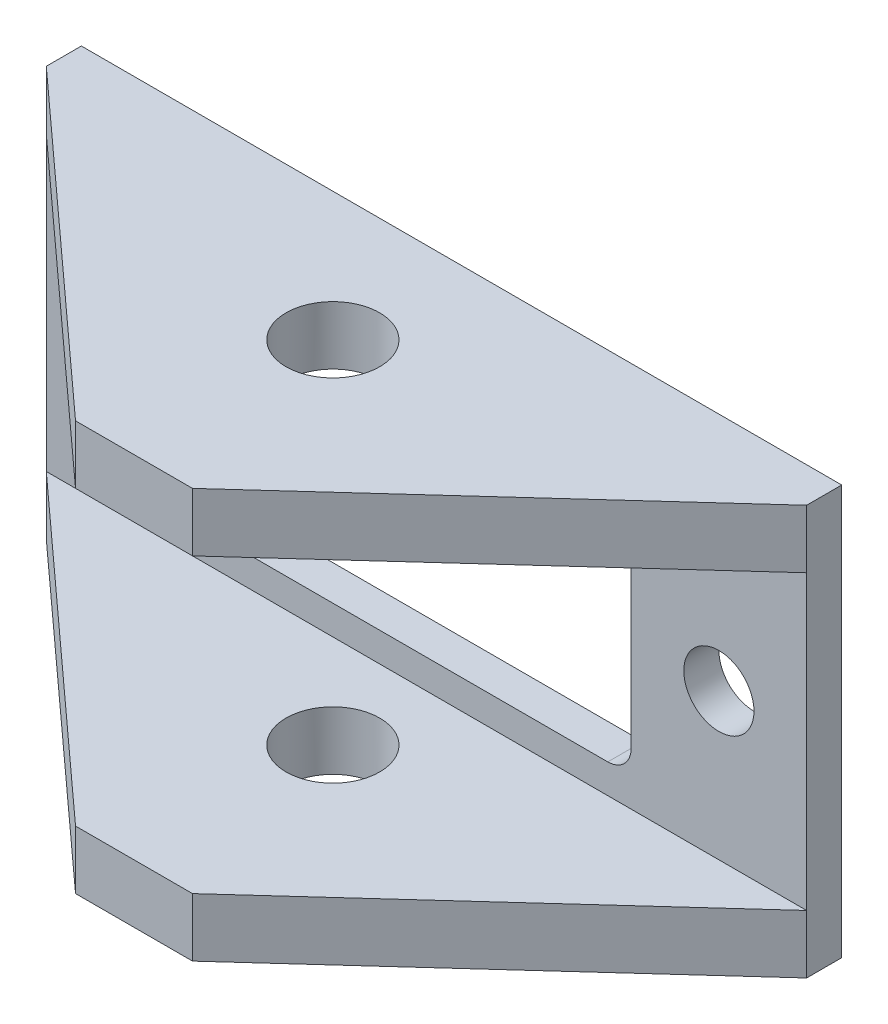
ISO-10303-21;
HEADER;
FILE_DESCRIPTION(('STEP AP214'),'2;1');
FILE_NAME('part.step','',(''),(''),'','','');
FILE_SCHEMA(('AUTOMOTIVE_DESIGN { 1 0 10303 214 1 1 1 1 }'));
ENDSEC;
DATA;
#1=APPLICATION_CONTEXT('core data for automotive mechanical design processes');
#2=APPLICATION_PROTOCOL_DEFINITION('international standard','automotive_design',2000,#1);
#3=PRODUCT_CONTEXT('',#1,'mechanical');
#4=PRODUCT('Part','Part','',(#3));
#5=PRODUCT_RELATED_PRODUCT_CATEGORY('part','',(#4));
#6=PRODUCT_DEFINITION_FORMATION('','',#4);
#7=PRODUCT_DEFINITION_CONTEXT('part definition',#1,'design');
#8=PRODUCT_DEFINITION('design','',#6,#7);
#9=PRODUCT_DEFINITION_SHAPE('','',#8);
#10=(LENGTH_UNIT() NAMED_UNIT(*) SI_UNIT(.MILLI.,.METRE.));
#11=(NAMED_UNIT(*) PLANE_ANGLE_UNIT() SI_UNIT($,.RADIAN.));
#12=(NAMED_UNIT(*) SI_UNIT($,.STERADIAN.) SOLID_ANGLE_UNIT());
#13=UNCERTAINTY_MEASURE_WITH_UNIT(LENGTH_MEASURE(1.E-05),#10,'distance_accuracy_value','');
#14=(GEOMETRIC_REPRESENTATION_CONTEXT(3) GLOBAL_UNCERTAINTY_ASSIGNED_CONTEXT((#13)) GLOBAL_UNIT_ASSIGNED_CONTEXT((#10,
#11,#12)) REPRESENTATION_CONTEXT('',''));
#15=CARTESIAN_POINT('',(0.,0.,0.));
#16=DIRECTION('',(0.,0.,1.));
#17=DIRECTION('',(1.,0.,0.));
#18=AXIS2_PLACEMENT_3D('',#15,#16,#17);
#19=CARTESIAN_POINT('',(0.,35.,-12.5));
#20=DIRECTION('',(0.,0.,-1.));
#21=DIRECTION('',(-1.,0.,0.));
#22=AXIS2_PLACEMENT_3D('',#19,#20,#21);
#23=PLANE('',#22);
#24=CARTESIAN_POINT('',(-25.,17.5,-12.5));
#25=DIRECTION('',(0.,0.,1.));
#26=DIRECTION('',(1.,0.,0.));
#27=AXIS2_PLACEMENT_3D('',#24,#25,#26);
#28=CIRCLE('',#27,3.);
#29=CARTESIAN_POINT('',(-22.,17.5,-12.5));
#30=VERTEX_POINT('',#29);
#31=EDGE_CURVE('E288',#30,#30,#28,.T.);
#32=ORIENTED_EDGE('',*,*,#31,.T.);
#33=EDGE_LOOP('',(#32));
#34=FACE_BOUND('',#33,.T.);
#35=CARTESIAN_POINT('',(25.,17.5,-12.5));
#36=DIRECTION('',(0.,0.,1.));
#37=DIRECTION('',(1.,0.,0.));
#38=AXIS2_PLACEMENT_3D('',#35,#36,#37);
#39=CIRCLE('',#38,3.);
#40=CARTESIAN_POINT('',(28.,17.5,-12.5));
#41=VERTEX_POINT('',#40);
#42=EDGE_CURVE('E282',#41,#41,#39,.T.);
#43=ORIENTED_EDGE('',*,*,#42,.T.);
#44=EDGE_LOOP('',(#43));
#45=FACE_BOUND('',#44,.T.);
#46=DIRECTION('',(1.,0.,0.));
#47=VECTOR('',#46,1.);
#48=CARTESIAN_POINT('',(0.,0.,-12.5));
#49=LINE('',#48,#47);
#50=CARTESIAN_POINT('',(-32.5,0.,-12.5));
#51=VERTEX_POINT('',#50);
#52=CARTESIAN_POINT('',(32.5,0.,-12.5));
#53=VERTEX_POINT('',#52);
#54=EDGE_CURVE('E330',#51,#53,#49,.T.);
#55=ORIENTED_EDGE('',*,*,#54,.F.);
#56=DIRECTION('',(0.,-1.,0.));
#57=VECTOR('',#56,1.);
#58=CARTESIAN_POINT('',(-32.5,35.,-12.5));
#59=LINE('',#58,#57);
#60=CARTESIAN_POINT('',(-32.5,35.,-12.5));
#61=VERTEX_POINT('',#60);
#62=EDGE_CURVE('E337',#61,#51,#59,.T.);
#63=ORIENTED_EDGE('',*,*,#62,.F.);
#64=DIRECTION('',(1.,0.,0.));
#65=VECTOR('',#64,1.);
#66=CARTESIAN_POINT('',(0.,35.,-12.5));
#67=LINE('',#66,#65);
#68=CARTESIAN_POINT('',(32.5,35.,-12.5));
#69=VERTEX_POINT('',#68);
#70=EDGE_CURVE('E313',#61,#69,#67,.T.);
#71=ORIENTED_EDGE('',*,*,#70,.T.);
#72=DIRECTION('',(0.,-1.,0.));
#73=VECTOR('',#72,1.);
#74=CARTESIAN_POINT('',(32.5,35.,-12.5));
#75=LINE('',#74,#73);
#76=EDGE_CURVE('E208',#69,#53,#75,.T.);
#77=ORIENTED_EDGE('',*,*,#76,.T.);
#78=EDGE_LOOP('',(#55,#63,#71,#77));
#79=FACE_BOUND('',#78,.T.);
#80=DIRECTION('',(0.,-1.,0.));
#81=VECTOR('',#80,1.);
#82=CARTESIAN_POINT('',(-17.5,0.,-12.5));
#83=LINE('',#82,#81);
#84=CARTESIAN_POINT('',(-17.5,25.5,-12.5));
#85=VERTEX_POINT('',#84);
#86=CARTESIAN_POINT('',(-17.5,9.5,-12.5));
#87=VERTEX_POINT('',#86);
#88=EDGE_CURVE('E285',#85,#87,#83,.T.);
#89=ORIENTED_EDGE('',*,*,#88,.T.);
#90=CARTESIAN_POINT('',(-15.5,9.5,-12.5));
#91=DIRECTION('',(0.,0.,-1.));
#92=DIRECTION('',(-1.,0.,0.));
#93=AXIS2_PLACEMENT_3D('',#90,#91,#92);
#94=CIRCLE('',#93,2.);
#95=CARTESIAN_POINT('',(-15.5,7.5,-12.5));
#96=VERTEX_POINT('',#95);
#97=EDGE_CURVE('E61',#87,#96,#94,.F.);
#98=ORIENTED_EDGE('',*,*,#97,.T.);
#99=DIRECTION('',(1.,0.,0.));
#100=VECTOR('',#99,1.);
#101=CARTESIAN_POINT('',(0.,7.5,-12.5));
#102=LINE('',#101,#100);
#103=CARTESIAN_POINT('',(15.5,7.5,-12.5));
#104=VERTEX_POINT('',#103);
#105=EDGE_CURVE('E233',#96,#104,#102,.T.);
#106=ORIENTED_EDGE('',*,*,#105,.T.);
#107=CARTESIAN_POINT('',(15.5,9.5,-12.5));
#108=DIRECTION('',(0.,0.,-1.));
#109=DIRECTION('',(-1.,0.,0.));
#110=AXIS2_PLACEMENT_3D('',#107,#108,#109);
#111=CIRCLE('',#110,2.);
#112=CARTESIAN_POINT('',(17.5,9.5,-12.5));
#113=VERTEX_POINT('',#112);
#114=EDGE_CURVE('E11',#104,#113,#111,.F.);
#115=ORIENTED_EDGE('',*,*,#114,.T.);
#116=DIRECTION('',(0.,-1.,0.));
#117=VECTOR('',#116,1.);
#118=CARTESIAN_POINT('',(17.5,0.,-12.5));
#119=LINE('',#118,#117);
#120=CARTESIAN_POINT('',(17.5,25.5,-12.5));
#121=VERTEX_POINT('',#120);
#122=EDGE_CURVE('E276',#121,#113,#119,.T.);
#123=ORIENTED_EDGE('',*,*,#122,.F.);
#124=CARTESIAN_POINT('',(15.5,25.5,-12.5));
#125=DIRECTION('',(0.,0.,-1.));
#126=DIRECTION('',(-1.,0.,0.));
#127=AXIS2_PLACEMENT_3D('',#124,#125,#126);
#128=CIRCLE('',#127,2.);
#129=CARTESIAN_POINT('',(15.5,27.5,-12.5));
#130=VERTEX_POINT('',#129);
#131=EDGE_CURVE('E257',#121,#130,#128,.F.);
#132=ORIENTED_EDGE('',*,*,#131,.T.);
#133=DIRECTION('',(1.,0.,0.));
#134=VECTOR('',#133,1.);
#135=CARTESIAN_POINT('',(0.,27.5,-12.5));
#136=LINE('',#135,#134);
#137=CARTESIAN_POINT('',(-15.5,27.5,-12.5));
#138=VERTEX_POINT('',#137);
#139=EDGE_CURVE('E281',#138,#130,#136,.T.);
#140=ORIENTED_EDGE('',*,*,#139,.F.);
#141=CARTESIAN_POINT('',(-15.5,25.5,-12.5));
#142=DIRECTION('',(0.,0.,-1.));
#143=DIRECTION('',(-1.,0.,0.));
#144=AXIS2_PLACEMENT_3D('',#141,#142,#143);
#145=CIRCLE('',#144,2.);
#146=EDGE_CURVE('E261',#138,#85,#145,.F.);
#147=ORIENTED_EDGE('',*,*,#146,.T.);
#148=EDGE_LOOP('',(#89,#98,#106,#115,#123,#132,#140,#147));
#149=FACE_BOUND('',#148,.T.);
#150=ADVANCED_FACE('F38',(#34,#45,#79,#149),#23,.T.);
#151=CARTESIAN_POINT('',(0.,0.,-9.5));
#152=DIRECTION('',(0.,0.,1.));
#153=DIRECTION('',(1.,0.,0.));
#154=AXIS2_PLACEMENT_3D('',#151,#152,#153);
#155=PLANE('',#154);
#156=CARTESIAN_POINT('',(-25.,17.5,-9.5));
#157=DIRECTION('',(0.,0.,1.));
#158=DIRECTION('',(1.,0.,0.));
#159=AXIS2_PLACEMENT_3D('',#156,#157,#158);
#160=CIRCLE('',#159,3.);
#161=CARTESIAN_POINT('',(-22.,17.5,-9.5));
#162=VERTEX_POINT('',#161);
#163=EDGE_CURVE('E232',#162,#162,#160,.T.);
#164=ORIENTED_EDGE('',*,*,#163,.F.);
#165=EDGE_LOOP('',(#164));
#166=FACE_BOUND('',#165,.T.);
#167=CARTESIAN_POINT('',(25.,17.5,-9.5));
#168=DIRECTION('',(0.,0.,1.));
#169=DIRECTION('',(1.,0.,0.));
#170=AXIS2_PLACEMENT_3D('',#167,#168,#169);
#171=CIRCLE('',#170,3.);
#172=CARTESIAN_POINT('',(28.,17.5,-9.5));
#173=VERTEX_POINT('',#172);
#174=EDGE_CURVE('E229',#173,#173,#171,.T.);
#175=ORIENTED_EDGE('',*,*,#174,.F.);
#176=EDGE_LOOP('',(#175));
#177=FACE_BOUND('',#176,.T.);
#178=DIRECTION('',(0.,-1.,0.));
#179=VECTOR('',#178,1.);
#180=CARTESIAN_POINT('',(32.5,0.,-9.5));
#181=LINE('',#180,#179);
#182=CARTESIAN_POINT('',(32.5,30.,-9.5));
#183=VERTEX_POINT('',#182);
#184=CARTESIAN_POINT('',(32.5,5.,-9.5));
#185=VERTEX_POINT('',#184);
#186=EDGE_CURVE('E175',#183,#185,#181,.T.);
#187=ORIENTED_EDGE('',*,*,#186,.F.);
#188=DIRECTION('',(1.,0.,0.));
#189=VECTOR('',#188,1.);
#190=CARTESIAN_POINT('',(0.,30.,-9.5));
#191=LINE('',#190,#189);
#192=CARTESIAN_POINT('',(-32.5,30.,-9.5));
#193=VERTEX_POINT('',#192);
#194=EDGE_CURVE('E164',#193,#183,#191,.T.);
#195=ORIENTED_EDGE('',*,*,#194,.F.);
#196=DIRECTION('',(0.,-1.,0.));
#197=VECTOR('',#196,1.);
#198=CARTESIAN_POINT('',(-32.5,0.,-9.5));
#199=LINE('',#198,#197);
#200=CARTESIAN_POINT('',(-32.5,5.,-9.5));
#201=VERTEX_POINT('',#200);
#202=EDGE_CURVE('E174',#193,#201,#199,.T.);
#203=ORIENTED_EDGE('',*,*,#202,.T.);
#204=DIRECTION('',(1.,0.,0.));
#205=VECTOR('',#204,1.);
#206=CARTESIAN_POINT('',(0.,5.,-9.5));
#207=LINE('',#206,#205);
#208=EDGE_CURVE('E182',#201,#185,#207,.T.);
#209=ORIENTED_EDGE('',*,*,#208,.T.);
#210=EDGE_LOOP('',(#187,#195,#203,#209));
#211=FACE_BOUND('',#210,.T.);
#212=DIRECTION('',(0.,-1.,0.));
#213=VECTOR('',#212,1.);
#214=CARTESIAN_POINT('',(-17.5,0.,-9.5));
#215=LINE('',#214,#213);
#216=CARTESIAN_POINT('',(-17.5,25.5,-9.5));
#217=VERTEX_POINT('',#216);
#218=CARTESIAN_POINT('',(-17.5,9.5,-9.5));
#219=VERTEX_POINT('',#218);
#220=EDGE_CURVE('E220',#217,#219,#215,.T.);
#221=ORIENTED_EDGE('',*,*,#220,.F.);
#222=CARTESIAN_POINT('',(-15.5,25.5,-9.5));
#223=DIRECTION('',(0.,0.,1.));
#224=DIRECTION('',(1.,0.,0.));
#225=AXIS2_PLACEMENT_3D('',#222,#223,#224);
#226=CIRCLE('',#225,2.);
#227=CARTESIAN_POINT('',(-15.5,27.5,-9.5));
#228=VERTEX_POINT('',#227);
#229=EDGE_CURVE('E259',#217,#228,#226,.F.);
#230=ORIENTED_EDGE('',*,*,#229,.T.);
#231=DIRECTION('',(1.,0.,0.));
#232=VECTOR('',#231,1.);
#233=CARTESIAN_POINT('',(0.,27.5,-9.5));
#234=LINE('',#233,#232);
#235=CARTESIAN_POINT('',(15.5,27.5,-9.5));
#236=VERTEX_POINT('',#235);
#237=EDGE_CURVE('E217',#228,#236,#234,.T.);
#238=ORIENTED_EDGE('',*,*,#237,.T.);
#239=CARTESIAN_POINT('',(15.5,25.5,-9.5));
#240=DIRECTION('',(0.,0.,1.));
#241=DIRECTION('',(1.,0.,0.));
#242=AXIS2_PLACEMENT_3D('',#239,#240,#241);
#243=CIRCLE('',#242,2.);
#244=CARTESIAN_POINT('',(17.5,25.5,-9.5));
#245=VERTEX_POINT('',#244);
#246=EDGE_CURVE('E255',#236,#245,#243,.F.);
#247=ORIENTED_EDGE('',*,*,#246,.T.);
#248=DIRECTION('',(0.,-1.,0.));
#249=VECTOR('',#248,1.);
#250=CARTESIAN_POINT('',(17.5,0.,-9.5));
#251=LINE('',#250,#249);
#252=CARTESIAN_POINT('',(17.5,9.5,-9.5));
#253=VERTEX_POINT('',#252);
#254=EDGE_CURVE('E225',#245,#253,#251,.T.);
#255=ORIENTED_EDGE('',*,*,#254,.T.);
#256=CARTESIAN_POINT('',(15.5,9.5,-9.5));
#257=DIRECTION('',(0.,0.,1.));
#258=DIRECTION('',(1.,0.,0.));
#259=AXIS2_PLACEMENT_3D('',#256,#257,#258);
#260=CIRCLE('',#259,2.);
#261=CARTESIAN_POINT('',(15.5,7.5,-9.5));
#262=VERTEX_POINT('',#261);
#263=EDGE_CURVE('E47',#253,#262,#260,.F.);
#264=ORIENTED_EDGE('',*,*,#263,.T.);
#265=DIRECTION('',(1.,0.,0.));
#266=VECTOR('',#265,1.);
#267=CARTESIAN_POINT('',(0.,7.5,-9.5));
#268=LINE('',#267,#266);
#269=CARTESIAN_POINT('',(-15.5,7.5,-9.5));
#270=VERTEX_POINT('',#269);
#271=EDGE_CURVE('E223',#270,#262,#268,.T.);
#272=ORIENTED_EDGE('',*,*,#271,.F.);
#273=CARTESIAN_POINT('',(-15.5,9.5,-9.5));
#274=DIRECTION('',(0.,0.,1.));
#275=DIRECTION('',(1.,0.,0.));
#276=AXIS2_PLACEMENT_3D('',#273,#274,#275);
#277=CIRCLE('',#276,2.);
#278=EDGE_CURVE('E263',#270,#219,#277,.F.);
#279=ORIENTED_EDGE('',*,*,#278,.T.);
#280=EDGE_LOOP('',(#221,#230,#238,#247,#255,#264,#272,#279));
#281=FACE_BOUND('',#280,.T.);
#282=ADVANCED_FACE('F179',(#166,#177,#211,#281),#155,.T.);
#283=CARTESIAN_POINT('',(-9.97737556561085,35.,10.9751131221719));
#284=DIRECTION('',(0.672672793996312,0.,-0.739940073395944));
#285=DIRECTION('',(-0.739940073395944,0.,-0.672672793996312));
#286=AXIS2_PLACEMENT_3D('',#283,#284,#285);
#287=PLANE('',#286);
#288=DIRECTION('',(-0.739940073395944,0.,-0.672672793996312));
#289=VECTOR('',#288,1.);
#290=CARTESIAN_POINT('',(-9.97737556561085,30.,10.9751131221719));
#291=LINE('',#290,#289);
#292=CARTESIAN_POINT('',(-5.,30.,15.5));
#293=VERTEX_POINT('',#292);
#294=EDGE_CURVE('E171',#293,#193,#291,.T.);
#295=ORIENTED_EDGE('',*,*,#294,.F.);
#296=DIRECTION('',(0.,-1.,0.));
#297=VECTOR('',#296,1.);
#298=CARTESIAN_POINT('',(-5.,35.,15.5));
#299=LINE('',#298,#297);
#300=CARTESIAN_POINT('',(-5.,35.,15.5));
#301=VERTEX_POINT('',#300);
#302=EDGE_CURVE('E198',#301,#293,#299,.T.);
#303=ORIENTED_EDGE('',*,*,#302,.F.);
#304=DIRECTION('',(0.739940073395944,0.,0.672672793996312));
#305=VECTOR('',#304,1.);
#306=CARTESIAN_POINT('',(-9.97737556561085,35.,10.9751131221719));
#307=LINE('',#306,#305);
#308=CARTESIAN_POINT('',(-32.5,35.,-9.5));
#309=VERTEX_POINT('',#308);
#310=EDGE_CURVE('E304',#309,#301,#307,.T.);
#311=ORIENTED_EDGE('',*,*,#310,.F.);
#312=DIRECTION('',(0.,-1.,0.));
#313=VECTOR('',#312,1.);
#314=CARTESIAN_POINT('',(-32.5,35.,-9.5));
#315=LINE('',#314,#313);
#316=EDGE_CURVE('E335',#309,#193,#315,.T.);
#317=ORIENTED_EDGE('',*,*,#316,.T.);
#318=EDGE_LOOP('',(#295,#303,#311,#317));
#319=FACE_BOUND('',#318,.T.);
#320=ADVANCED_FACE('F378',(#319),#287,.F.);
#321=CARTESIAN_POINT('',(0.,35.,15.5));
#322=DIRECTION('',(0.,0.,-1.));
#323=DIRECTION('',(-1.,0.,0.));
#324=AXIS2_PLACEMENT_3D('',#321,#322,#323);
#325=PLANE('',#324);
#326=DIRECTION('',(-1.,0.,0.));
#327=VECTOR('',#326,1.);
#328=CARTESIAN_POINT('',(0.,30.,15.5));
#329=LINE('',#328,#327);
#330=CARTESIAN_POINT('',(5.,30.,15.5));
#331=VERTEX_POINT('',#330);
#332=EDGE_CURVE('E186',#331,#293,#329,.T.);
#333=ORIENTED_EDGE('',*,*,#332,.F.);
#334=DIRECTION('',(0.,-1.,0.));
#335=VECTOR('',#334,1.);
#336=CARTESIAN_POINT('',(5.,35.,15.5));
#337=LINE('',#336,#335);
#338=CARTESIAN_POINT('',(5.,35.,15.5));
#339=VERTEX_POINT('',#338);
#340=EDGE_CURVE('E196',#339,#331,#337,.T.);
#341=ORIENTED_EDGE('',*,*,#340,.F.);
#342=DIRECTION('',(1.,0.,0.));
#343=VECTOR('',#342,1.);
#344=CARTESIAN_POINT('',(0.,35.,15.5));
#345=LINE('',#344,#343);
#346=EDGE_CURVE('E307',#301,#339,#345,.T.);
#347=ORIENTED_EDGE('',*,*,#346,.F.);
#348=ORIENTED_EDGE('',*,*,#302,.T.);
#349=EDGE_LOOP('',(#333,#341,#347,#348));
#350=FACE_BOUND('',#349,.T.);
#351=ADVANCED_FACE('F370',(#350),#325,.F.);
#352=CARTESIAN_POINT('',(9.97737556561086,35.,10.9751131221719));
#353=DIRECTION('',(-0.672672793996312,0.,-0.739940073395944));
#354=DIRECTION('',(-0.739940073395944,0.,0.672672793996313));
#355=AXIS2_PLACEMENT_3D('',#352,#353,#354);
#356=PLANE('',#355);
#357=DIRECTION('',(-0.739940073395944,0.,0.672672793996313));
#358=VECTOR('',#357,1.);
#359=CARTESIAN_POINT('',(9.97737556561086,30.,10.9751131221719));
#360=LINE('',#359,#358);
#361=EDGE_CURVE('E168',#183,#331,#360,.T.);
#362=ORIENTED_EDGE('',*,*,#361,.F.);
#363=DIRECTION('',(0.,-1.,0.));
#364=VECTOR('',#363,1.);
#365=CARTESIAN_POINT('',(32.5,35.,-9.5));
#366=LINE('',#365,#364);
#367=CARTESIAN_POINT('',(32.5,35.,-9.5));
#368=VERTEX_POINT('',#367);
#369=EDGE_CURVE('E193',#368,#183,#366,.T.);
#370=ORIENTED_EDGE('',*,*,#369,.F.);
#371=DIRECTION('',(0.739940073395944,0.,-0.672672793996313));
#372=VECTOR('',#371,1.);
#373=CARTESIAN_POINT('',(9.97737556561086,35.,10.9751131221719));
#374=LINE('',#373,#372);
#375=EDGE_CURVE('E310',#339,#368,#374,.T.);
#376=ORIENTED_EDGE('',*,*,#375,.F.);
#377=ORIENTED_EDGE('',*,*,#340,.T.);
#378=EDGE_LOOP('',(#362,#370,#376,#377));
#379=FACE_BOUND('',#378,.T.);
#380=ADVANCED_FACE('F191',(#379),#356,.F.);
#381=CARTESIAN_POINT('',(-5.,5.,15.5));
#382=VERTEX_POINT('',#381);
#383=CARTESIAN_POINT('',(-5.,0.,15.5));
#384=VERTEX_POINT('',#383);
#385=EDGE_CURVE('E212',#382,#384,#299,.T.);
#386=ORIENTED_EDGE('',*,*,#385,.F.);
#387=DIRECTION('',(-0.739940073395944,0.,-0.672672793996312));
#388=VECTOR('',#387,1.);
#389=CARTESIAN_POINT('',(-9.97737556561085,5.,10.9751131221719));
#390=LINE('',#389,#388);
#391=EDGE_CURVE('E300',#382,#201,#390,.T.);
#392=ORIENTED_EDGE('',*,*,#391,.T.);
#393=CARTESIAN_POINT('',(-32.5,0.,-9.5));
#394=VERTEX_POINT('',#393);
#395=EDGE_CURVE('E318',#201,#394,#315,.T.);
#396=ORIENTED_EDGE('',*,*,#395,.T.);
#397=DIRECTION('',(0.739940073395944,0.,0.672672793996312));
#398=VECTOR('',#397,1.);
#399=CARTESIAN_POINT('',(-9.97737556561085,0.,10.9751131221719));
#400=LINE('',#399,#398);
#401=EDGE_CURVE('E303',#394,#384,#400,.T.);
#402=ORIENTED_EDGE('',*,*,#401,.T.);
#403=EDGE_LOOP('',(#386,#392,#396,#402));
#404=FACE_BOUND('',#403,.T.);
#405=ADVANCED_FACE('F354',(#404),#287,.F.);
#406=CARTESIAN_POINT('',(5.,5.,15.5));
#407=VERTEX_POINT('',#406);
#408=CARTESIAN_POINT('',(5.,0.,15.5));
#409=VERTEX_POINT('',#408);
#410=EDGE_CURVE('E204',#407,#409,#337,.T.);
#411=ORIENTED_EDGE('',*,*,#410,.F.);
#412=DIRECTION('',(-1.,0.,0.));
#413=VECTOR('',#412,1.);
#414=CARTESIAN_POINT('',(0.,5.,15.5));
#415=LINE('',#414,#413);
#416=EDGE_CURVE('E236',#407,#382,#415,.T.);
#417=ORIENTED_EDGE('',*,*,#416,.T.);
#418=ORIENTED_EDGE('',*,*,#385,.T.);
#419=DIRECTION('',(1.,0.,0.));
#420=VECTOR('',#419,1.);
#421=CARTESIAN_POINT('',(0.,0.,15.5));
#422=LINE('',#421,#420);
#423=EDGE_CURVE('E321',#384,#409,#422,.T.);
#424=ORIENTED_EDGE('',*,*,#423,.T.);
#425=EDGE_LOOP('',(#411,#417,#418,#424));
#426=FACE_BOUND('',#425,.T.);
#427=ADVANCED_FACE('F359',(#426),#325,.F.);
#428=CARTESIAN_POINT('',(32.5,0.,-9.5));
#429=VERTEX_POINT('',#428);
#430=EDGE_CURVE('E205',#185,#429,#366,.T.);
#431=ORIENTED_EDGE('',*,*,#430,.F.);
#432=DIRECTION('',(-0.739940073395944,0.,0.672672793996313));
#433=VECTOR('',#432,1.);
#434=CARTESIAN_POINT('',(9.97737556561086,5.,10.9751131221719));
#435=LINE('',#434,#433);
#436=EDGE_CURVE('E197',#185,#407,#435,.T.);
#437=ORIENTED_EDGE('',*,*,#436,.T.);
#438=ORIENTED_EDGE('',*,*,#410,.T.);
#439=DIRECTION('',(0.739940073395944,0.,-0.672672793996313));
#440=VECTOR('',#439,1.);
#441=CARTESIAN_POINT('',(9.97737556561086,0.,10.9751131221719));
#442=LINE('',#441,#440);
#443=EDGE_CURVE('E324',#409,#429,#442,.T.);
#444=ORIENTED_EDGE('',*,*,#443,.T.);
#445=EDGE_LOOP('',(#431,#437,#438,#444));
#446=FACE_BOUND('',#445,.T.);
#447=ADVANCED_FACE('F361',(#446),#356,.F.);
#448=CARTESIAN_POINT('',(32.5,35.,-1.50342701251323E-13));
#449=DIRECTION('',(1.,0.,0.));
#450=DIRECTION('',(0.,0.,-1.));
#451=AXIS2_PLACEMENT_3D('',#448,#449,#450);
#452=PLANE('',#451);
#453=DIRECTION('',(0.,0.,1.));
#454=VECTOR('',#453,1.);
#455=CARTESIAN_POINT('',(32.5,0.,-1.50342701251323E-13));
#456=LINE('',#455,#454);
#457=EDGE_CURVE('E327',#53,#429,#456,.T.);
#458=ORIENTED_EDGE('',*,*,#457,.F.);
#459=ORIENTED_EDGE('',*,*,#76,.F.);
#460=DIRECTION('',(0.,0.,1.));
#461=VECTOR('',#460,1.);
#462=CARTESIAN_POINT('',(32.5,35.,-1.50342701251323E-13));
#463=LINE('',#462,#461);
#464=EDGE_CURVE('E203',#69,#368,#463,.T.);
#465=ORIENTED_EDGE('',*,*,#464,.T.);
#466=ORIENTED_EDGE('',*,*,#369,.T.);
#467=ORIENTED_EDGE('',*,*,#186,.T.);
#468=ORIENTED_EDGE('',*,*,#430,.T.);
#469=EDGE_LOOP('',(#458,#459,#465,#466,#467,#468));
#470=FACE_BOUND('',#469,.T.);
#471=ADVANCED_FACE('F201',(#470),#452,.T.);
#472=CARTESIAN_POINT('',(-32.5,35.,0.));
#473=DIRECTION('',(1.,0.,0.));
#474=DIRECTION('',(0.,0.,-1.));
#475=AXIS2_PLACEMENT_3D('',#472,#473,#474);
#476=PLANE('',#475);
#477=DIRECTION('',(0.,0.,1.));
#478=VECTOR('',#477,1.);
#479=CARTESIAN_POINT('',(-32.5,0.,0.));
#480=LINE('',#479,#478);
#481=EDGE_CURVE('E308',#51,#394,#480,.T.);
#482=ORIENTED_EDGE('',*,*,#481,.T.);
#483=ORIENTED_EDGE('',*,*,#395,.F.);
#484=ORIENTED_EDGE('',*,*,#202,.F.);
#485=ORIENTED_EDGE('',*,*,#316,.F.);
#486=DIRECTION('',(0.,0.,1.));
#487=VECTOR('',#486,1.);
#488=CARTESIAN_POINT('',(-32.5,35.,0.));
#489=LINE('',#488,#487);
#490=EDGE_CURVE('E316',#61,#309,#489,.T.);
#491=ORIENTED_EDGE('',*,*,#490,.F.);
#492=ORIENTED_EDGE('',*,*,#62,.T.);
#493=EDGE_LOOP('',(#482,#483,#484,#485,#491,#492));
#494=FACE_BOUND('',#493,.T.);
#495=ADVANCED_FACE('F350',(#494),#476,.F.);
#496=CARTESIAN_POINT('',(0.,35.,0.));
#497=DIRECTION('',(0.,1.,0.));
#498=DIRECTION('',(0.,0.,1.));
#499=AXIS2_PLACEMENT_3D('',#496,#497,#498);
#500=PLANE('',#499);
#501=CARTESIAN_POINT('',(0.,35.,-1.5));
#502=DIRECTION('',(0.,1.,0.));
#503=DIRECTION('',(0.,0.,1.));
#504=AXIS2_PLACEMENT_3D('',#501,#502,#503);
#505=CIRCLE('',#504,4.);
#506=CARTESIAN_POINT('',(0.,35.,2.5));
#507=VERTEX_POINT('',#506);
#508=EDGE_CURVE('E433',#507,#507,#505,.T.);
#509=ORIENTED_EDGE('',*,*,#508,.F.);
#510=EDGE_LOOP('',(#509));
#511=FACE_BOUND('',#510,.T.);
#512=ORIENTED_EDGE('',*,*,#310,.T.);
#513=ORIENTED_EDGE('',*,*,#346,.T.);
#514=ORIENTED_EDGE('',*,*,#375,.T.);
#515=ORIENTED_EDGE('',*,*,#464,.F.);
#516=ORIENTED_EDGE('',*,*,#70,.F.);
#517=ORIENTED_EDGE('',*,*,#490,.T.);
#518=EDGE_LOOP('',(#512,#513,#514,#515,#516,#517));
#519=FACE_BOUND('',#518,.T.);
#520=ADVANCED_FACE('F386',(#511,#519),#500,.T.);
#521=CARTESIAN_POINT('',(0.,0.,0.));
#522=DIRECTION('',(0.,1.,0.));
#523=DIRECTION('',(0.,0.,1.));
#524=AXIS2_PLACEMENT_3D('',#521,#522,#523);
#525=PLANE('',#524);
#526=CARTESIAN_POINT('',(0.,0.,-1.5));
#527=DIRECTION('',(0.,1.,0.));
#528=DIRECTION('',(0.,0.,1.));
#529=AXIS2_PLACEMENT_3D('',#526,#527,#528);
#530=CIRCLE('',#529,4.);
#531=CARTESIAN_POINT('',(0.,0.,2.5));
#532=VERTEX_POINT('',#531);
#533=EDGE_CURVE('E437',#532,#532,#530,.T.);
#534=ORIENTED_EDGE('',*,*,#533,.T.);
#535=EDGE_LOOP('',(#534));
#536=FACE_BOUND('',#535,.T.);
#537=ORIENTED_EDGE('',*,*,#401,.F.);
#538=ORIENTED_EDGE('',*,*,#481,.F.);
#539=ORIENTED_EDGE('',*,*,#54,.T.);
#540=ORIENTED_EDGE('',*,*,#457,.T.);
#541=ORIENTED_EDGE('',*,*,#443,.F.);
#542=ORIENTED_EDGE('',*,*,#423,.F.);
#543=EDGE_LOOP('',(#537,#538,#539,#540,#541,#542));
#544=FACE_BOUND('',#543,.T.);
#545=ADVANCED_FACE('F347',(#536,#544),#525,.F.);
#546=CARTESIAN_POINT('',(0.,5.,-9.5));
#547=DIRECTION('',(0.,-1.,0.));
#548=DIRECTION('',(0.,0.,-1.));
#549=AXIS2_PLACEMENT_3D('',#546,#547,#548);
#550=PLANE('',#549);
#551=CARTESIAN_POINT('',(0.,5.,-1.5));
#552=DIRECTION('',(0.,-1.,0.));
#553=DIRECTION('',(0.,0.,-1.));
#554=AXIS2_PLACEMENT_3D('',#551,#552,#553);
#555=CIRCLE('',#554,4.);
#556=CARTESIAN_POINT('',(0.,5.,-5.50000000000001));
#557=VERTEX_POINT('',#556);
#558=EDGE_CURVE('E436',#557,#557,#555,.T.);
#559=ORIENTED_EDGE('',*,*,#558,.T.);
#560=EDGE_LOOP('',(#559));
#561=FACE_BOUND('',#560,.T.);
#562=ORIENTED_EDGE('',*,*,#416,.F.);
#563=ORIENTED_EDGE('',*,*,#436,.F.);
#564=ORIENTED_EDGE('',*,*,#208,.F.);
#565=ORIENTED_EDGE('',*,*,#391,.F.);
#566=EDGE_LOOP('',(#562,#563,#564,#565));
#567=FACE_BOUND('',#566,.T.);
#568=ADVANCED_FACE('F356',(#561,#567),#550,.F.);
#569=CARTESIAN_POINT('',(0.,30.,-9.5));
#570=DIRECTION('',(0.,-1.,0.));
#571=DIRECTION('',(0.,0.,-1.));
#572=AXIS2_PLACEMENT_3D('',#569,#570,#571);
#573=PLANE('',#572);
#574=CARTESIAN_POINT('',(0.,30.,-1.5));
#575=DIRECTION('',(0.,-1.,0.));
#576=DIRECTION('',(0.,0.,-1.));
#577=AXIS2_PLACEMENT_3D('',#574,#575,#576);
#578=CIRCLE('',#577,4.);
#579=CARTESIAN_POINT('',(0.,30.,-5.50000000000001));
#580=VERTEX_POINT('',#579);
#581=EDGE_CURVE('E42',#580,#580,#578,.T.);
#582=ORIENTED_EDGE('',*,*,#581,.F.);
#583=EDGE_LOOP('',(#582));
#584=FACE_BOUND('',#583,.T.);
#585=ORIENTED_EDGE('',*,*,#294,.T.);
#586=ORIENTED_EDGE('',*,*,#194,.T.);
#587=ORIENTED_EDGE('',*,*,#361,.T.);
#588=ORIENTED_EDGE('',*,*,#332,.T.);
#589=EDGE_LOOP('',(#585,#586,#587,#588));
#590=FACE_BOUND('',#589,.T.);
#591=ADVANCED_FACE('F166',(#584,#590),#573,.T.);
#592=CARTESIAN_POINT('',(17.5,0.,-12.5));
#593=DIRECTION('',(-1.,0.,0.));
#594=DIRECTION('',(0.,-1.,0.));
#595=AXIS2_PLACEMENT_3D('',#592,#593,#594);
#596=PLANE('',#595);
#597=ORIENTED_EDGE('',*,*,#254,.F.);
#598=DIRECTION('',(0.,0.,1.));
#599=VECTOR('',#598,1.);
#600=CARTESIAN_POINT('',(17.5,25.5,-12.5));
#601=LINE('',#600,#599);
#602=EDGE_CURVE('E244',#245,#121,#601,.F.);
#603=ORIENTED_EDGE('',*,*,#602,.T.);
#604=ORIENTED_EDGE('',*,*,#122,.T.);
#605=DIRECTION('',(0.,0.,1.));
#606=VECTOR('',#605,1.);
#607=CARTESIAN_POINT('',(17.5,9.5,-12.5));
#608=LINE('',#607,#606);
#609=EDGE_CURVE('E241',#113,#253,#608,.T.);
#610=ORIENTED_EDGE('',*,*,#609,.T.);
#611=EDGE_LOOP('',(#597,#603,#604,#610));
#612=FACE_BOUND('',#611,.T.);
#613=ADVANCED_FACE('F279',(#612),#596,.T.);
#614=CARTESIAN_POINT('',(0.,7.5,-12.5));
#615=DIRECTION('',(0.,-1.,0.));
#616=DIRECTION('',(0.,0.,-1.));
#617=AXIS2_PLACEMENT_3D('',#614,#615,#616);
#618=PLANE('',#617);
#619=ORIENTED_EDGE('',*,*,#105,.F.);
#620=DIRECTION('',(0.,0.,1.));
#621=VECTOR('',#620,1.);
#622=CARTESIAN_POINT('',(-15.5,7.5,-9.5));
#623=LINE('',#622,#621);
#624=EDGE_CURVE('E252',#96,#270,#623,.T.);
#625=ORIENTED_EDGE('',*,*,#624,.T.);
#626=ORIENTED_EDGE('',*,*,#271,.T.);
#627=DIRECTION('',(0.,0.,1.));
#628=VECTOR('',#627,1.);
#629=CARTESIAN_POINT('',(15.5,7.5,-12.5));
#630=LINE('',#629,#628);
#631=EDGE_CURVE('E54',#262,#104,#630,.F.);
#632=ORIENTED_EDGE('',*,*,#631,.T.);
#633=EDGE_LOOP('',(#619,#625,#626,#632));
#634=FACE_BOUND('',#633,.T.);
#635=ADVANCED_FACE('F271',(#634),#618,.F.);
#636=CARTESIAN_POINT('',(-17.5,0.,-12.5));
#637=DIRECTION('',(-1.,0.,0.));
#638=DIRECTION('',(0.,-1.,0.));
#639=AXIS2_PLACEMENT_3D('',#636,#637,#638);
#640=PLANE('',#639);
#641=ORIENTED_EDGE('',*,*,#88,.F.);
#642=DIRECTION('',(0.,0.,1.));
#643=VECTOR('',#642,1.);
#644=CARTESIAN_POINT('',(-17.5,25.5,-12.5));
#645=LINE('',#644,#643);
#646=EDGE_CURVE('E248',#85,#217,#645,.T.);
#647=ORIENTED_EDGE('',*,*,#646,.T.);
#648=ORIENTED_EDGE('',*,*,#220,.T.);
#649=DIRECTION('',(0.,0.,1.));
#650=VECTOR('',#649,1.);
#651=CARTESIAN_POINT('',(-17.5,9.5,-12.5));
#652=LINE('',#651,#650);
#653=EDGE_CURVE('E246',#219,#87,#652,.F.);
#654=ORIENTED_EDGE('',*,*,#653,.T.);
#655=EDGE_LOOP('',(#641,#647,#648,#654));
#656=FACE_BOUND('',#655,.T.);
#657=ADVANCED_FACE('F405',(#656),#640,.F.);
#658=CARTESIAN_POINT('',(0.,27.5,-12.5));
#659=DIRECTION('',(0.,-1.,0.));
#660=DIRECTION('',(0.,0.,-1.));
#661=AXIS2_PLACEMENT_3D('',#658,#659,#660);
#662=PLANE('',#661);
#663=ORIENTED_EDGE('',*,*,#139,.T.);
#664=DIRECTION('',(0.,0.,1.));
#665=VECTOR('',#664,1.);
#666=CARTESIAN_POINT('',(15.5,27.5,-9.5));
#667=LINE('',#666,#665);
#668=EDGE_CURVE('E238',#130,#236,#667,.T.);
#669=ORIENTED_EDGE('',*,*,#668,.T.);
#670=ORIENTED_EDGE('',*,*,#237,.F.);
#671=DIRECTION('',(0.,0.,1.));
#672=VECTOR('',#671,1.);
#673=CARTESIAN_POINT('',(-15.5,27.5,-12.5));
#674=LINE('',#673,#672);
#675=EDGE_CURVE('E228',#228,#138,#674,.F.);
#676=ORIENTED_EDGE('',*,*,#675,.T.);
#677=EDGE_LOOP('',(#663,#669,#670,#676));
#678=FACE_BOUND('',#677,.T.);
#679=ADVANCED_FACE('F401',(#678),#662,.T.);
#680=CARTESIAN_POINT('',(25.,17.5,-12.5));
#681=DIRECTION('',(0.,0.,1.));
#682=DIRECTION('',(1.,0.,0.));
#683=AXIS2_PLACEMENT_3D('',#680,#681,#682);
#684=CYLINDRICAL_SURFACE('',#683,3.);
#685=ORIENTED_EDGE('',*,*,#174,.T.);
#686=EDGE_LOOP('',(#685));
#687=FACE_BOUND('',#686,.T.);
#688=ORIENTED_EDGE('',*,*,#42,.F.);
#689=EDGE_LOOP('',(#688));
#690=FACE_BOUND('',#689,.T.);
#691=ADVANCED_FACE('F404',(#687,#690),#684,.F.);
#692=CARTESIAN_POINT('',(-25.,17.5,-12.5));
#693=DIRECTION('',(0.,0.,1.));
#694=DIRECTION('',(1.,0.,0.));
#695=AXIS2_PLACEMENT_3D('',#692,#693,#694);
#696=CYLINDRICAL_SURFACE('',#695,3.);
#697=ORIENTED_EDGE('',*,*,#163,.T.);
#698=EDGE_LOOP('',(#697));
#699=FACE_BOUND('',#698,.T.);
#700=ORIENTED_EDGE('',*,*,#31,.F.);
#701=EDGE_LOOP('',(#700));
#702=FACE_BOUND('',#701,.T.);
#703=ADVANCED_FACE('F412',(#699,#702),#696,.F.);
#704=CARTESIAN_POINT('',(15.5,25.5,-12.5));
#705=DIRECTION('',(0.,0.,-1.));
#706=DIRECTION('',(-1.,0.,0.));
#707=AXIS2_PLACEMENT_3D('',#704,#705,#706);
#708=CYLINDRICAL_SURFACE('',#707,2.);
#709=ORIENTED_EDGE('',*,*,#131,.F.);
#710=ORIENTED_EDGE('',*,*,#602,.F.);
#711=ORIENTED_EDGE('',*,*,#246,.F.);
#712=ORIENTED_EDGE('',*,*,#668,.F.);
#713=EDGE_LOOP('',(#709,#710,#711,#712));
#714=FACE_BOUND('',#713,.T.);
#715=ADVANCED_FACE('F415',(#714),#708,.F.);
#716=CARTESIAN_POINT('',(-15.5,25.5,-12.5));
#717=DIRECTION('',(0.,0.,1.));
#718=DIRECTION('',(1.,0.,0.));
#719=AXIS2_PLACEMENT_3D('',#716,#717,#718);
#720=CYLINDRICAL_SURFACE('',#719,2.);
#721=ORIENTED_EDGE('',*,*,#146,.F.);
#722=ORIENTED_EDGE('',*,*,#675,.F.);
#723=ORIENTED_EDGE('',*,*,#229,.F.);
#724=ORIENTED_EDGE('',*,*,#646,.F.);
#725=EDGE_LOOP('',(#721,#722,#723,#724));
#726=FACE_BOUND('',#725,.T.);
#727=ADVANCED_FACE('F462',(#726),#720,.F.);
#728=CARTESIAN_POINT('',(-15.5,9.5,-12.5));
#729=DIRECTION('',(0.,0.,-1.));
#730=DIRECTION('',(-1.,0.,0.));
#731=AXIS2_PLACEMENT_3D('',#728,#729,#730);
#732=CYLINDRICAL_SURFACE('',#731,2.);
#733=ORIENTED_EDGE('',*,*,#97,.F.);
#734=ORIENTED_EDGE('',*,*,#653,.F.);
#735=ORIENTED_EDGE('',*,*,#278,.F.);
#736=ORIENTED_EDGE('',*,*,#624,.F.);
#737=EDGE_LOOP('',(#733,#734,#735,#736));
#738=FACE_BOUND('',#737,.T.);
#739=ADVANCED_FACE('F429',(#738),#732,.F.);
#740=CARTESIAN_POINT('',(15.5,9.5,-12.5));
#741=DIRECTION('',(0.,0.,1.));
#742=DIRECTION('',(1.,0.,0.));
#743=AXIS2_PLACEMENT_3D('',#740,#741,#742);
#744=CYLINDRICAL_SURFACE('',#743,2.);
#745=ORIENTED_EDGE('',*,*,#114,.F.);
#746=ORIENTED_EDGE('',*,*,#631,.F.);
#747=ORIENTED_EDGE('',*,*,#263,.F.);
#748=ORIENTED_EDGE('',*,*,#609,.F.);
#749=EDGE_LOOP('',(#745,#746,#747,#748));
#750=FACE_BOUND('',#749,.T.);
#751=ADVANCED_FACE('F40',(#750),#744,.F.);
#752=CARTESIAN_POINT('',(0.,0.,-1.5));
#753=DIRECTION('',(0.,1.,0.));
#754=DIRECTION('',(0.,0.,1.));
#755=AXIS2_PLACEMENT_3D('',#752,#753,#754);
#756=CYLINDRICAL_SURFACE('',#755,4.);
#757=ORIENTED_EDGE('',*,*,#508,.T.);
#758=EDGE_LOOP('',(#757));
#759=FACE_BOUND('',#758,.T.);
#760=ORIENTED_EDGE('',*,*,#581,.T.);
#761=EDGE_LOOP('',(#760));
#762=FACE_BOUND('',#761,.T.);
#763=ADVANCED_FACE('F420',(#759,#762),#756,.F.);
#764=ORIENTED_EDGE('',*,*,#533,.F.);
#765=EDGE_LOOP('',(#764));
#766=FACE_BOUND('',#765,.T.);
#767=ORIENTED_EDGE('',*,*,#558,.F.);
#768=EDGE_LOOP('',(#767));
#769=FACE_BOUND('',#768,.T.);
#770=ADVANCED_FACE('F422',(#766,#769),#756,.F.);
#771=CLOSED_SHELL('',(#150,#282,#320,#351,#380,#405,#427,#447,#471,#495,#520,#545,#568,#591,
#613,#635,#657,#679,#691,#703,#715,#727,#739,#751,#763,#770));
#772=MANIFOLD_SOLID_BREP('B2',#771);
#773=ADVANCED_BREP_SHAPE_REPRESENTATION('',(#18,#772),#14);
#774=SHAPE_DEFINITION_REPRESENTATION(#9,#773);
ENDSEC;
END-ISO-10303-21;
